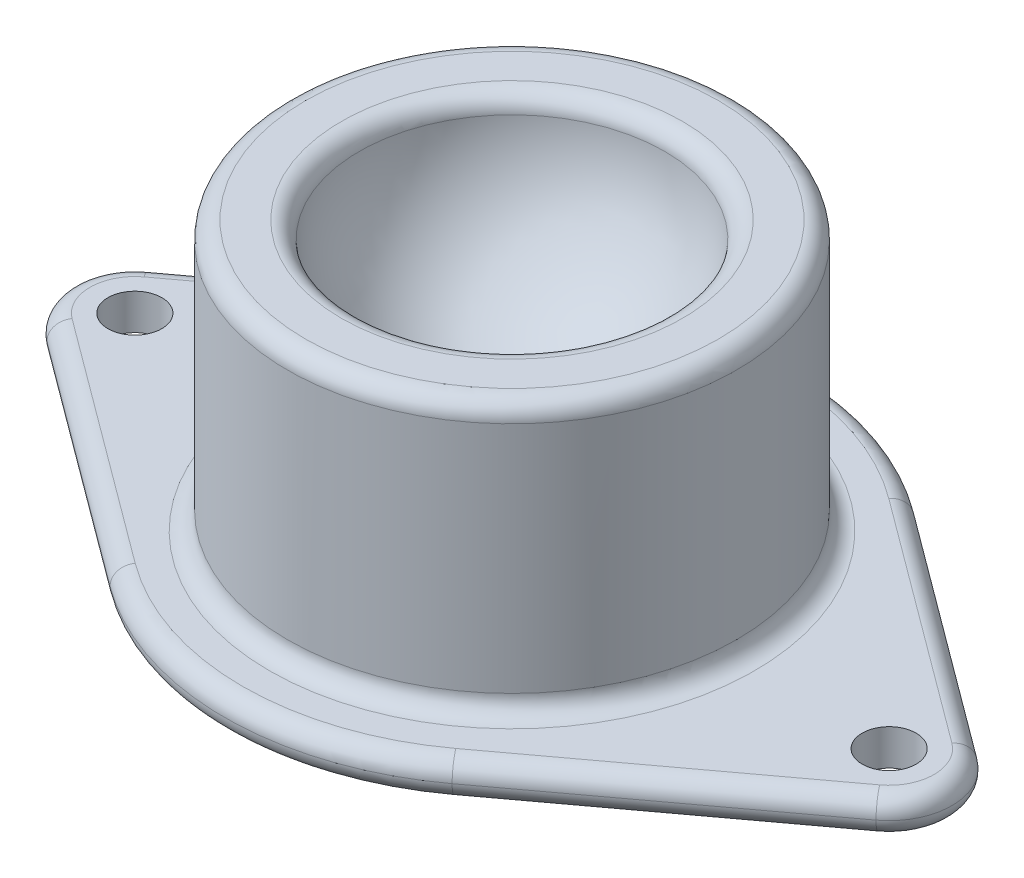
ISO-10303-21;
HEADER;
FILE_DESCRIPTION(('STEP AP214'),'2;1');
FILE_NAME('part.step','',(''),(''),'','','');
FILE_SCHEMA(('AUTOMOTIVE_DESIGN { 1 0 10303 214 1 1 1 1 }'));
ENDSEC;
DATA;
#1=APPLICATION_CONTEXT('core data for automotive mechanical design processes');
#2=APPLICATION_PROTOCOL_DEFINITION('international standard','automotive_design',2000,#1);
#3=PRODUCT_CONTEXT('',#1,'mechanical');
#4=PRODUCT('Part','Part','',(#3));
#5=PRODUCT_RELATED_PRODUCT_CATEGORY('part','',(#4));
#6=PRODUCT_DEFINITION_FORMATION('','',#4);
#7=PRODUCT_DEFINITION_CONTEXT('part definition',#1,'design');
#8=PRODUCT_DEFINITION('design','',#6,#7);
#9=PRODUCT_DEFINITION_SHAPE('','',#8);
#10=(LENGTH_UNIT() NAMED_UNIT(*) SI_UNIT(.MILLI.,.METRE.));
#11=(NAMED_UNIT(*) PLANE_ANGLE_UNIT() SI_UNIT($,.RADIAN.));
#12=(NAMED_UNIT(*) SI_UNIT($,.STERADIAN.) SOLID_ANGLE_UNIT());
#13=UNCERTAINTY_MEASURE_WITH_UNIT(LENGTH_MEASURE(1.E-05),#10,'distance_accuracy_value','');
#14=(GEOMETRIC_REPRESENTATION_CONTEXT(3) GLOBAL_UNCERTAINTY_ASSIGNED_CONTEXT((#13)) GLOBAL_UNIT_ASSIGNED_CONTEXT((#10,
#11,#12)) REPRESENTATION_CONTEXT('',''));
#15=CARTESIAN_POINT('',(0.,0.,0.));
#16=DIRECTION('',(0.,0.,1.));
#17=DIRECTION('',(1.,0.,0.));
#18=AXIS2_PLACEMENT_3D('',#15,#16,#17);
#19=CARTESIAN_POINT('',(-21.,2.,0.));
#20=DIRECTION('',(0.,-1.,0.));
#21=DIRECTION('',(0.,0.,-1.));
#22=AXIS2_PLACEMENT_3D('',#19,#20,#21);
#23=CYLINDRICAL_SURFACE('',#22,1.5);
#24=CARTESIAN_POINT('',(-21.,2.,0.));
#25=DIRECTION('',(0.,1.,0.));
#26=DIRECTION('',(0.,0.,1.));
#27=AXIS2_PLACEMENT_3D('',#24,#25,#26);
#28=CIRCLE('',#27,1.5);
#29=CARTESIAN_POINT('',(-21.,2.,1.5));
#30=VERTEX_POINT('',#29);
#31=EDGE_CURVE('E304',#30,#30,#28,.T.);
#32=ORIENTED_EDGE('',*,*,#31,.T.);
#33=EDGE_LOOP('',(#32));
#34=FACE_BOUND('',#33,.T.);
#35=CARTESIAN_POINT('',(-21.,0.,0.));
#36=DIRECTION('',(0.,1.,0.));
#37=DIRECTION('',(0.,0.,1.));
#38=AXIS2_PLACEMENT_3D('',#35,#36,#37);
#39=CIRCLE('',#38,1.5);
#40=CARTESIAN_POINT('',(-21.,0.,1.5));
#41=VERTEX_POINT('',#40);
#42=EDGE_CURVE('E150',#41,#41,#39,.T.);
#43=ORIENTED_EDGE('',*,*,#42,.F.);
#44=EDGE_LOOP('',(#43));
#45=FACE_BOUND('',#44,.T.);
#46=ADVANCED_FACE('F41',(#34,#45),#23,.F.);
#47=CARTESIAN_POINT('',(21.,2.,0.));
#48=DIRECTION('',(0.,-1.,0.));
#49=DIRECTION('',(0.,0.,-1.));
#50=AXIS2_PLACEMENT_3D('',#47,#48,#49);
#51=CYLINDRICAL_SURFACE('',#50,1.5);
#52=CARTESIAN_POINT('',(21.,2.,0.));
#53=DIRECTION('',(0.,1.,0.));
#54=DIRECTION('',(0.,0.,1.));
#55=AXIS2_PLACEMENT_3D('',#52,#53,#54);
#56=CIRCLE('',#55,1.5);
#57=CARTESIAN_POINT('',(21.,2.,1.5));
#58=VERTEX_POINT('',#57);
#59=EDGE_CURVE('E300',#58,#58,#56,.T.);
#60=ORIENTED_EDGE('',*,*,#59,.T.);
#61=EDGE_LOOP('',(#60));
#62=FACE_BOUND('',#61,.T.);
#63=CARTESIAN_POINT('',(21.,0.,0.));
#64=DIRECTION('',(0.,1.,0.));
#65=DIRECTION('',(0.,0.,1.));
#66=AXIS2_PLACEMENT_3D('',#63,#64,#65);
#67=CIRCLE('',#66,1.5);
#68=CARTESIAN_POINT('',(21.,0.,1.5));
#69=VERTEX_POINT('',#68);
#70=EDGE_CURVE('E301',#69,#69,#67,.T.);
#71=ORIENTED_EDGE('',*,*,#70,.F.);
#72=EDGE_LOOP('',(#71));
#73=FACE_BOUND('',#72,.T.);
#74=ADVANCED_FACE('F317',(#62,#73),#51,.F.);
#75=CARTESIAN_POINT('',(0.,2.,0.));
#76=DIRECTION('',(0.,1.,0.));
#77=DIRECTION('',(0.,0.,1.));
#78=AXIS2_PLACEMENT_3D('',#75,#76,#77);
#79=PLANE('',#78);
#80=DIRECTION('',(-0.803549382413629,0.,0.595238095238095));
#81=VECTOR('',#80,1.);
#82=CARTESIAN_POINT('',(8.92857142857142,2.,12.0532407362044));
#83=LINE('',#82,#81);
#84=CARTESIAN_POINT('',(8.92857142857143,2.,12.0532407362044));
#85=VERTEX_POINT('',#84);
#86=CARTESIAN_POINT('',(22.4880952380952,2.,2.00887345603407));
#87=VERTEX_POINT('',#86);
#88=EDGE_CURVE('E60',#85,#87,#83,.F.);
#89=ORIENTED_EDGE('',*,*,#88,.T.);
#90=CARTESIAN_POINT('',(21.,2.,0.));
#91=DIRECTION('',(0.,1.,0.));
#92=DIRECTION('',(0.,0.,1.));
#93=AXIS2_PLACEMENT_3D('',#90,#91,#92);
#94=CIRCLE('',#93,2.5);
#95=CARTESIAN_POINT('',(22.4880952380952,2.,-2.00887345603407));
#96=VERTEX_POINT('',#95);
#97=EDGE_CURVE('E155',#87,#96,#94,.T.);
#98=ORIENTED_EDGE('',*,*,#97,.T.);
#99=DIRECTION('',(-0.803549382413629,0.,-0.595238095238095));
#100=VECTOR('',#99,1.);
#101=CARTESIAN_POINT('',(8.92857142857142,2.,-12.0532407362044));
#102=LINE('',#101,#100);
#103=CARTESIAN_POINT('',(8.92857142857142,2.,-12.0532407362044));
#104=VERTEX_POINT('',#103);
#105=EDGE_CURVE('E256',#96,#104,#102,.T.);
#106=ORIENTED_EDGE('',*,*,#105,.T.);
#107=CARTESIAN_POINT('',(0.,2.,0.));
#108=DIRECTION('',(0.,1.,0.));
#109=DIRECTION('',(0.,0.,1.));
#110=AXIS2_PLACEMENT_3D('',#107,#108,#109);
#111=CIRCLE('',#110,15.);
#112=CARTESIAN_POINT('',(-8.92857142857143,2.,-12.0532407362044));
#113=VERTEX_POINT('',#112);
#114=EDGE_CURVE('E258',#104,#113,#111,.T.);
#115=ORIENTED_EDGE('',*,*,#114,.T.);
#116=DIRECTION('',(-0.803549382413629,0.,0.595238095238095));
#117=VECTOR('',#116,1.);
#118=CARTESIAN_POINT('',(-22.4880952380952,2.,-2.00887345603406));
#119=LINE('',#118,#117);
#120=CARTESIAN_POINT('',(-22.4880952380952,2.,-2.00887345603407));
#121=VERTEX_POINT('',#120);
#122=EDGE_CURVE('E266',#113,#121,#119,.T.);
#123=ORIENTED_EDGE('',*,*,#122,.T.);
#124=CARTESIAN_POINT('',(-21.,2.,0.));
#125=DIRECTION('',(0.,1.,0.));
#126=DIRECTION('',(0.,0.,1.));
#127=AXIS2_PLACEMENT_3D('',#124,#125,#126);
#128=CIRCLE('',#127,2.5);
#129=CARTESIAN_POINT('',(-22.4880952380952,2.,2.00887345603407));
#130=VERTEX_POINT('',#129);
#131=EDGE_CURVE('E145',#121,#130,#128,.T.);
#132=ORIENTED_EDGE('',*,*,#131,.T.);
#133=DIRECTION('',(0.803549382413629,0.,0.595238095238095));
#134=VECTOR('',#133,1.);
#135=CARTESIAN_POINT('',(-8.92857142857143,2.,12.0532407362044));
#136=LINE('',#135,#134);
#137=CARTESIAN_POINT('',(-8.92857142857143,2.,12.0532407362044));
#138=VERTEX_POINT('',#137);
#139=EDGE_CURVE('E139',#130,#138,#136,.T.);
#140=ORIENTED_EDGE('',*,*,#139,.T.);
#141=CARTESIAN_POINT('',(0.,2.,0.));
#142=DIRECTION('',(0.,1.,0.));
#143=DIRECTION('',(0.,0.,1.));
#144=AXIS2_PLACEMENT_3D('',#141,#142,#143);
#145=CIRCLE('',#144,15.);
#146=EDGE_CURVE('E142',#138,#85,#145,.T.);
#147=ORIENTED_EDGE('',*,*,#146,.T.);
#148=EDGE_LOOP('',(#89,#98,#106,#115,#123,#132,#140,#147));
#149=FACE_BOUND('',#148,.T.);
#150=CARTESIAN_POINT('',(0.,2.,0.));
#151=DIRECTION('',(0.,1.,0.));
#152=DIRECTION('',(0.,0.,1.));
#153=AXIS2_PLACEMENT_3D('',#150,#151,#152);
#154=CIRCLE('',#153,13.5);
#155=CARTESIAN_POINT('',(0.,2.,13.5));
#156=VERTEX_POINT('',#155);
#157=EDGE_CURVE('E261',#156,#156,#154,.F.);
#158=ORIENTED_EDGE('',*,*,#157,.T.);
#159=EDGE_LOOP('',(#158));
#160=FACE_BOUND('',#159,.T.);
#161=ORIENTED_EDGE('',*,*,#31,.F.);
#162=EDGE_LOOP('',(#161));
#163=FACE_BOUND('',#162,.T.);
#164=ORIENTED_EDGE('',*,*,#59,.F.);
#165=EDGE_LOOP('',(#164));
#166=FACE_BOUND('',#165,.T.);
#167=ADVANCED_FACE('F140',(#149,#160,#163,#166),#79,.T.);
#168=CARTESIAN_POINT('',(0.,0.,0.));
#169=DIRECTION('',(0.,1.,0.));
#170=DIRECTION('',(0.,0.,1.));
#171=AXIS2_PLACEMENT_3D('',#168,#169,#170);
#172=PLANE('',#171);
#173=CARTESIAN_POINT('',(0.,0.,0.));
#174=DIRECTION('',(0.,1.,0.));
#175=DIRECTION('',(0.,0.,1.));
#176=AXIS2_PLACEMENT_3D('',#173,#174,#175);
#177=CIRCLE('',#176,15.);
#178=CARTESIAN_POINT('',(-8.92857142857143,0.,-12.0532407362044));
#179=VERTEX_POINT('',#178);
#180=CARTESIAN_POINT('',(8.92857142857143,0.,-12.0532407362044));
#181=VERTEX_POINT('',#180);
#182=EDGE_CURVE('E280',#179,#181,#177,.F.);
#183=ORIENTED_EDGE('',*,*,#182,.T.);
#184=DIRECTION('',(-0.803549382413629,0.,-0.595238095238095));
#185=VECTOR('',#184,1.);
#186=CARTESIAN_POINT('',(8.92857142857142,0.,-12.0532407362044));
#187=LINE('',#186,#185);
#188=CARTESIAN_POINT('',(22.4880952380952,0.,-2.00887345603407));
#189=VERTEX_POINT('',#188);
#190=EDGE_CURVE('E276',#181,#189,#187,.F.);
#191=ORIENTED_EDGE('',*,*,#190,.T.);
#192=CARTESIAN_POINT('',(21.,0.,0.));
#193=DIRECTION('',(0.,1.,0.));
#194=DIRECTION('',(0.,0.,1.));
#195=AXIS2_PLACEMENT_3D('',#192,#193,#194);
#196=CIRCLE('',#195,2.5);
#197=CARTESIAN_POINT('',(22.4880952380952,0.,2.00887345603407));
#198=VERTEX_POINT('',#197);
#199=EDGE_CURVE('E290',#189,#198,#196,.F.);
#200=ORIENTED_EDGE('',*,*,#199,.T.);
#201=DIRECTION('',(-0.803549382413629,0.,0.595238095238095));
#202=VECTOR('',#201,1.);
#203=CARTESIAN_POINT('',(8.92857142857143,0.,12.0532407362044));
#204=LINE('',#203,#202);
#205=CARTESIAN_POINT('',(8.92857142857143,0.,12.0532407362044));
#206=VERTEX_POINT('',#205);
#207=EDGE_CURVE('E292',#198,#206,#204,.T.);
#208=ORIENTED_EDGE('',*,*,#207,.T.);
#209=CARTESIAN_POINT('',(0.,0.,0.));
#210=DIRECTION('',(0.,1.,0.));
#211=DIRECTION('',(0.,0.,1.));
#212=AXIS2_PLACEMENT_3D('',#209,#210,#211);
#213=CIRCLE('',#212,15.);
#214=CARTESIAN_POINT('',(-8.92857142857143,0.,12.0532407362044));
#215=VERTEX_POINT('',#214);
#216=EDGE_CURVE('E294',#206,#215,#213,.F.);
#217=ORIENTED_EDGE('',*,*,#216,.T.);
#218=DIRECTION('',(0.803549382413629,0.,0.595238095238095));
#219=VECTOR('',#218,1.);
#220=CARTESIAN_POINT('',(-8.92857142857143,0.,12.0532407362044));
#221=LINE('',#220,#219);
#222=CARTESIAN_POINT('',(-22.4880952380952,0.,2.00887345603407));
#223=VERTEX_POINT('',#222);
#224=EDGE_CURVE('E244',#215,#223,#221,.F.);
#225=ORIENTED_EDGE('',*,*,#224,.T.);
#226=CARTESIAN_POINT('',(-21.,0.,0.));
#227=DIRECTION('',(0.,1.,0.));
#228=DIRECTION('',(0.,0.,1.));
#229=AXIS2_PLACEMENT_3D('',#226,#227,#228);
#230=CIRCLE('',#229,2.5);
#231=CARTESIAN_POINT('',(-22.4880952380952,0.,-2.00887345603407));
#232=VERTEX_POINT('',#231);
#233=EDGE_CURVE('E240',#223,#232,#230,.F.);
#234=ORIENTED_EDGE('',*,*,#233,.T.);
#235=DIRECTION('',(-0.803549382413629,0.,0.595238095238095));
#236=VECTOR('',#235,1.);
#237=CARTESIAN_POINT('',(-8.92857142857142,0.,-12.0532407362044));
#238=LINE('',#237,#236);
#239=EDGE_CURVE('E103',#232,#179,#238,.F.);
#240=ORIENTED_EDGE('',*,*,#239,.T.);
#241=EDGE_LOOP('',(#183,#191,#200,#208,#217,#225,#234,#240));
#242=FACE_BOUND('',#241,.T.);
#243=ORIENTED_EDGE('',*,*,#42,.T.);
#244=EDGE_LOOP('',(#243));
#245=FACE_BOUND('',#244,.T.);
#246=ORIENTED_EDGE('',*,*,#70,.T.);
#247=EDGE_LOOP('',(#246));
#248=FACE_BOUND('',#247,.T.);
#249=ADVANCED_FACE('F316',(#242,#245,#248),#172,.F.);
#250=CARTESIAN_POINT('',(0.,2.,0.));
#251=DIRECTION('',(0.,-1.,0.));
#252=DIRECTION('',(0.,0.,-1.));
#253=AXIS2_PLACEMENT_3D('',#250,#251,#252);
#254=CYLINDRICAL_SURFACE('',#253,12.5);
#255=CARTESIAN_POINT('',(0.,3.,0.));
#256=DIRECTION('',(0.,1.,0.));
#257=DIRECTION('',(0.,0.,1.));
#258=AXIS2_PLACEMENT_3D('',#255,#256,#257);
#259=CIRCLE('',#258,12.5);
#260=CARTESIAN_POINT('',(0.,3.,12.5));
#261=VERTEX_POINT('',#260);
#262=EDGE_CURVE('E163',#261,#261,#259,.T.);
#263=ORIENTED_EDGE('',*,*,#262,.T.);
#264=EDGE_LOOP('',(#263));
#265=FACE_BOUND('',#264,.T.);
#266=CARTESIAN_POINT('',(0.,16.,0.));
#267=DIRECTION('',(0.,-1.,0.));
#268=DIRECTION('',(0.,0.,-1.));
#269=AXIS2_PLACEMENT_3D('',#266,#267,#268);
#270=CIRCLE('',#269,12.5);
#271=CARTESIAN_POINT('',(0.,16.,-12.5));
#272=VERTEX_POINT('',#271);
#273=EDGE_CURVE('E160',#272,#272,#270,.T.);
#274=ORIENTED_EDGE('',*,*,#273,.T.);
#275=EDGE_LOOP('',(#274));
#276=FACE_BOUND('',#275,.T.);
#277=ADVANCED_FACE('F327',(#265,#276),#254,.T.);
#278=CARTESIAN_POINT('',(0.,17.,8.5));
#279=DIRECTION('',(0.,-1.,0.));
#280=DIRECTION('',(0.,0.,-1.));
#281=AXIS2_PLACEMENT_3D('',#278,#279,#280);
#282=PLANE('',#281);
#283=CARTESIAN_POINT('',(0.,17.,0.));
#284=DIRECTION('',(0.,-1.,0.));
#285=DIRECTION('',(0.,0.,-1.));
#286=AXIS2_PLACEMENT_3D('',#283,#284,#285);
#287=CIRCLE('',#286,11.5);
#288=CARTESIAN_POINT('',(0.,17.,-11.5));
#289=VERTEX_POINT('',#288);
#290=EDGE_CURVE('E51',#289,#289,#287,.F.);
#291=ORIENTED_EDGE('',*,*,#290,.T.);
#292=EDGE_LOOP('',(#291));
#293=FACE_BOUND('',#292,.T.);
#294=CARTESIAN_POINT('',(0.,17.,0.));
#295=DIRECTION('',(0.,-1.,0.));
#296=DIRECTION('',(0.,0.,-1.));
#297=AXIS2_PLACEMENT_3D('',#294,#295,#296);
#298=CIRCLE('',#297,9.5);
#299=CARTESIAN_POINT('',(0.,17.,-9.5));
#300=VERTEX_POINT('',#299);
#301=EDGE_CURVE('E166',#300,#300,#298,.T.);
#302=ORIENTED_EDGE('',*,*,#301,.T.);
#303=EDGE_LOOP('',(#302));
#304=FACE_BOUND('',#303,.T.);
#305=ADVANCED_FACE('F332',(#293,#304),#282,.F.);
#306=CARTESIAN_POINT('',(0.,16.5138888888889,0.));
#307=DIRECTION('',(0.,-1.,0.));
#308=DIRECTION('',(0.,0.,-1.));
#309=AXIS2_PLACEMENT_3D('',#306,#307,#308);
#310=SPHERICAL_SURFACE('',#309,8.51388888888889);
#311=CARTESIAN_POINT('',(0.,16.0540145985401,0.));
#312=DIRECTION('',(0.,1.,0.));
#313=DIRECTION('',(0.,0.,1.));
#314=AXIS2_PLACEMENT_3D('',#311,#312,#313);
#315=CIRCLE('',#314,8.5014598540146);
#316=CARTESIAN_POINT('',(0.,16.0540145985401,8.5014598540146));
#317=VERTEX_POINT('',#316);
#318=EDGE_CURVE('E12',#317,#317,#315,.T.);
#319=ORIENTED_EDGE('',*,*,#318,.T.);
#320=EDGE_LOOP('',(#319));
#321=FACE_BOUND('',#320,.T.);
#322=ADVANCED_FACE('F378',(#321),#310,.F.);
#323=CARTESIAN_POINT('',(-8.92857142857143,1.,12.0532407362044));
#324=DIRECTION('',(-0.803549382413629,0.,-0.595238095238095));
#325=DIRECTION('',(-0.595238095238095,0.,0.803549382413629));
#326=AXIS2_PLACEMENT_3D('',#323,#324,#325);
#327=CYLINDRICAL_SURFACE('',#326,1.);
#328=CARTESIAN_POINT('',(-8.92857142857143,1.,12.0532407362044));
#329=DIRECTION('',(0.803549382413629,0.,0.595238095238095));
#330=DIRECTION('',(0.595238095238095,0.,-0.803549382413629));
#331=AXIS2_PLACEMENT_3D('',#328,#329,#330);
#332=CIRCLE('',#331,1.);
#333=CARTESIAN_POINT('',(-9.52380952380953,1.,12.8567901186181));
#334=VERTEX_POINT('',#333);
#335=EDGE_CURVE('E45',#138,#334,#332,.T.);
#336=ORIENTED_EDGE('',*,*,#335,.F.);
#337=ORIENTED_EDGE('',*,*,#139,.F.);
#338=CARTESIAN_POINT('',(-22.4880952380952,1.,2.00887345603406));
#339=DIRECTION('',(-0.803549382413628,0.,-0.595238095238096));
#340=DIRECTION('',(-0.595238095238096,0.,0.803549382413628));
#341=AXIS2_PLACEMENT_3D('',#338,#339,#340);
#342=CIRCLE('',#341,1.);
#343=CARTESIAN_POINT('',(-23.0833333333333,1.,2.8124228384477));
#344=VERTEX_POINT('',#343);
#345=EDGE_CURVE('E89',#344,#130,#342,.T.);
#346=ORIENTED_EDGE('',*,*,#345,.F.);
#347=DIRECTION('',(0.803549382413629,0.,0.595238095238095));
#348=VECTOR('',#347,1.);
#349=CARTESIAN_POINT('',(-23.0833333333333,1.,2.81242283844769));
#350=LINE('',#349,#348);
#351=EDGE_CURVE('E148',#334,#344,#350,.F.);
#352=ORIENTED_EDGE('',*,*,#351,.F.);
#353=EDGE_LOOP('',(#336,#337,#346,#352));
#354=FACE_BOUND('',#353,.T.);
#355=ADVANCED_FACE('F147',(#354),#327,.T.);
#356=CARTESIAN_POINT('',(0.,1.,0.));
#357=DIRECTION('',(0.,1.,0.));
#358=DIRECTION('',(0.,0.,1.));
#359=AXIS2_PLACEMENT_3D('',#356,#357,#358);
#360=TOROIDAL_SURFACE('',#359,15.,1.);
#361=ORIENTED_EDGE('',*,*,#146,.F.);
#362=ORIENTED_EDGE('',*,*,#335,.T.);
#363=CARTESIAN_POINT('',(0.,1.,0.));
#364=DIRECTION('',(0.,1.,0.));
#365=DIRECTION('',(0.,0.,1.));
#366=AXIS2_PLACEMENT_3D('',#363,#364,#365);
#367=CIRCLE('',#366,16.);
#368=CARTESIAN_POINT('',(9.52380952380952,1.,12.8567901186181));
#369=VERTEX_POINT('',#368);
#370=EDGE_CURVE('E225',#369,#334,#367,.F.);
#371=ORIENTED_EDGE('',*,*,#370,.F.);
#372=CARTESIAN_POINT('',(8.92857142857143,1.,12.0532407362044));
#373=DIRECTION('',(0.803549382413629,0.,-0.595238095238095));
#374=DIRECTION('',(-0.595238095238095,0.,-0.803549382413629));
#375=AXIS2_PLACEMENT_3D('',#372,#373,#374);
#376=CIRCLE('',#375,1.);
#377=EDGE_CURVE('E153',#85,#369,#376,.T.);
#378=ORIENTED_EDGE('',*,*,#377,.F.);
#379=EDGE_LOOP('',(#361,#362,#371,#378));
#380=FACE_BOUND('',#379,.T.);
#381=ADVANCED_FACE('F151',(#380),#360,.T.);
#382=CARTESIAN_POINT('',(-21.,1.,0.));
#383=DIRECTION('',(0.,1.,0.));
#384=DIRECTION('',(0.,0.,1.));
#385=AXIS2_PLACEMENT_3D('',#382,#383,#384);
#386=TOROIDAL_SURFACE('',#385,2.5,1.);
#387=ORIENTED_EDGE('',*,*,#345,.T.);
#388=ORIENTED_EDGE('',*,*,#131,.F.);
#389=CARTESIAN_POINT('',(-22.4880952380952,1.,-2.00887345603407));
#390=DIRECTION('',(0.803549382413628,0.,-0.595238095238096));
#391=DIRECTION('',(-0.595238095238096,0.,-0.803549382413628));
#392=AXIS2_PLACEMENT_3D('',#389,#390,#391);
#393=CIRCLE('',#392,1.);
#394=CARTESIAN_POINT('',(-23.0833333333333,1.,-2.8124228384477));
#395=VERTEX_POINT('',#394);
#396=EDGE_CURVE('E221',#395,#121,#393,.T.);
#397=ORIENTED_EDGE('',*,*,#396,.F.);
#398=CARTESIAN_POINT('',(-21.,1.,0.));
#399=DIRECTION('',(0.,1.,0.));
#400=DIRECTION('',(0.,0.,1.));
#401=AXIS2_PLACEMENT_3D('',#398,#399,#400);
#402=CIRCLE('',#401,3.5);
#403=EDGE_CURVE('E218',#344,#395,#402,.F.);
#404=ORIENTED_EDGE('',*,*,#403,.F.);
#405=EDGE_LOOP('',(#387,#388,#397,#404));
#406=FACE_BOUND('',#405,.T.);
#407=ADVANCED_FACE('F233',(#406),#386,.T.);
#408=CARTESIAN_POINT('',(-8.92857142857143,1.,12.0532407362044));
#409=DIRECTION('',(0.803549382413629,0.,0.595238095238095));
#410=DIRECTION('',(0.595238095238095,0.,-0.803549382413629));
#411=AXIS2_PLACEMENT_3D('',#408,#409,#410);
#412=CYLINDRICAL_SURFACE('',#411,1.);
#413=CARTESIAN_POINT('',(-22.4880952380952,1.,2.00887345603406));
#414=DIRECTION('',(-0.803549382413628,0.,-0.595238095238096));
#415=DIRECTION('',(-0.595238095238096,0.,0.803549382413628));
#416=AXIS2_PLACEMENT_3D('',#413,#414,#415);
#417=CIRCLE('',#416,1.);
#418=EDGE_CURVE('E215',#223,#344,#417,.T.);
#419=ORIENTED_EDGE('',*,*,#418,.F.);
#420=ORIENTED_EDGE('',*,*,#224,.F.);
#421=CARTESIAN_POINT('',(-8.92857142857143,1.,12.0532407362044));
#422=DIRECTION('',(0.803549382413629,0.,0.595238095238095));
#423=DIRECTION('',(0.595238095238095,0.,-0.803549382413629));
#424=AXIS2_PLACEMENT_3D('',#421,#422,#423);
#425=CIRCLE('',#424,1.);
#426=EDGE_CURVE('E228',#334,#215,#425,.T.);
#427=ORIENTED_EDGE('',*,*,#426,.F.);
#428=ORIENTED_EDGE('',*,*,#351,.T.);
#429=EDGE_LOOP('',(#419,#420,#427,#428));
#430=FACE_BOUND('',#429,.T.);
#431=ADVANCED_FACE('F243',(#430),#412,.T.);
#432=CARTESIAN_POINT('',(0.,1.,0.));
#433=DIRECTION('',(0.,1.,0.));
#434=DIRECTION('',(0.,0.,1.));
#435=AXIS2_PLACEMENT_3D('',#432,#433,#434);
#436=TOROIDAL_SURFACE('',#435,15.,1.);
#437=ORIENTED_EDGE('',*,*,#426,.T.);
#438=ORIENTED_EDGE('',*,*,#216,.F.);
#439=CARTESIAN_POINT('',(8.92857142857143,1.,12.0532407362044));
#440=DIRECTION('',(0.803549382413629,0.,-0.595238095238095));
#441=DIRECTION('',(-0.595238095238095,0.,-0.803549382413629));
#442=AXIS2_PLACEMENT_3D('',#439,#440,#441);
#443=CIRCLE('',#442,1.);
#444=EDGE_CURVE('E212',#369,#206,#443,.T.);
#445=ORIENTED_EDGE('',*,*,#444,.F.);
#446=ORIENTED_EDGE('',*,*,#370,.T.);
#447=EDGE_LOOP('',(#437,#438,#445,#446));
#448=FACE_BOUND('',#447,.T.);
#449=ADVANCED_FACE('F248',(#448),#436,.T.);
#450=CARTESIAN_POINT('',(8.92857142857142,1.,12.0532407362044));
#451=DIRECTION('',(-0.803549382413629,0.,0.595238095238095));
#452=DIRECTION('',(0.595238095238095,0.,0.803549382413629));
#453=AXIS2_PLACEMENT_3D('',#450,#451,#452);
#454=CYLINDRICAL_SURFACE('',#453,1.);
#455=ORIENTED_EDGE('',*,*,#88,.F.);
#456=ORIENTED_EDGE('',*,*,#377,.T.);
#457=DIRECTION('',(-0.803549382413629,0.,0.595238095238095));
#458=VECTOR('',#457,1.);
#459=CARTESIAN_POINT('',(9.52380952380952,1.,12.8567901186181));
#460=LINE('',#459,#458);
#461=CARTESIAN_POINT('',(23.0833333333333,1.,2.8124228384477));
#462=VERTEX_POINT('',#461);
#463=EDGE_CURVE('E209',#462,#369,#460,.T.);
#464=ORIENTED_EDGE('',*,*,#463,.F.);
#465=CARTESIAN_POINT('',(22.4880952380952,1.,2.00887345603407));
#466=DIRECTION('',(0.803549382413629,0.,-0.595238095238096));
#467=DIRECTION('',(-0.595238095238096,0.,-0.803549382413629));
#468=AXIS2_PLACEMENT_3D('',#465,#466,#467);
#469=CIRCLE('',#468,1.);
#470=EDGE_CURVE('E206',#87,#462,#469,.T.);
#471=ORIENTED_EDGE('',*,*,#470,.F.);
#472=EDGE_LOOP('',(#455,#456,#464,#471));
#473=FACE_BOUND('',#472,.T.);
#474=ADVANCED_FACE('F250',(#473),#454,.T.);
#475=CARTESIAN_POINT('',(-8.92857142857142,1.,-12.0532407362044));
#476=DIRECTION('',(0.803549382413629,0.,-0.595238095238095));
#477=DIRECTION('',(-0.595238095238095,0.,-0.803549382413629));
#478=AXIS2_PLACEMENT_3D('',#475,#476,#477);
#479=CYLINDRICAL_SURFACE('',#478,1.);
#480=ORIENTED_EDGE('',*,*,#396,.T.);
#481=ORIENTED_EDGE('',*,*,#122,.F.);
#482=CARTESIAN_POINT('',(-8.92857142857143,1.,-12.0532407362044));
#483=DIRECTION('',(0.803549382413629,0.,-0.595238095238095));
#484=DIRECTION('',(-0.595238095238095,0.,-0.803549382413629));
#485=AXIS2_PLACEMENT_3D('',#482,#483,#484);
#486=CIRCLE('',#485,1.);
#487=CARTESIAN_POINT('',(-9.52380952380952,1.,-12.8567901186181));
#488=VERTEX_POINT('',#487);
#489=EDGE_CURVE('E203',#488,#113,#486,.T.);
#490=ORIENTED_EDGE('',*,*,#489,.F.);
#491=DIRECTION('',(-0.803549382413629,0.,0.595238095238095));
#492=VECTOR('',#491,1.);
#493=CARTESIAN_POINT('',(-9.52380952380952,1.,-12.8567901186181));
#494=LINE('',#493,#492);
#495=EDGE_CURVE('E200',#395,#488,#494,.F.);
#496=ORIENTED_EDGE('',*,*,#495,.F.);
#497=EDGE_LOOP('',(#480,#481,#490,#496));
#498=FACE_BOUND('',#497,.T.);
#499=ADVANCED_FACE('F284',(#498),#479,.T.);
#500=CARTESIAN_POINT('',(-21.,1.,0.));
#501=DIRECTION('',(0.,1.,0.));
#502=DIRECTION('',(0.,0.,1.));
#503=AXIS2_PLACEMENT_3D('',#500,#501,#502);
#504=TOROIDAL_SURFACE('',#503,2.5,1.);
#505=ORIENTED_EDGE('',*,*,#418,.T.);
#506=ORIENTED_EDGE('',*,*,#403,.T.);
#507=CARTESIAN_POINT('',(-22.4880952380952,1.,-2.00887345603407));
#508=DIRECTION('',(0.803549382413628,0.,-0.595238095238096));
#509=DIRECTION('',(-0.595238095238097,0.,-0.803549382413628));
#510=AXIS2_PLACEMENT_3D('',#507,#508,#509);
#511=CIRCLE('',#510,1.);
#512=EDGE_CURVE('E197',#232,#395,#511,.T.);
#513=ORIENTED_EDGE('',*,*,#512,.F.);
#514=ORIENTED_EDGE('',*,*,#233,.F.);
#515=EDGE_LOOP('',(#505,#506,#513,#514));
#516=FACE_BOUND('',#515,.T.);
#517=ADVANCED_FACE('F239',(#516),#504,.T.);
#518=CARTESIAN_POINT('',(8.92857142857142,1.,12.0532407362044));
#519=DIRECTION('',(0.803549382413629,0.,-0.595238095238095));
#520=DIRECTION('',(-0.595238095238095,0.,-0.803549382413629));
#521=AXIS2_PLACEMENT_3D('',#518,#519,#520);
#522=CYLINDRICAL_SURFACE('',#521,1.);
#523=ORIENTED_EDGE('',*,*,#444,.T.);
#524=ORIENTED_EDGE('',*,*,#207,.F.);
#525=CARTESIAN_POINT('',(22.4880952380952,1.,2.00887345603407));
#526=DIRECTION('',(0.803549382413628,0.,-0.595238095238096));
#527=DIRECTION('',(-0.595238095238096,0.,-0.803549382413628));
#528=AXIS2_PLACEMENT_3D('',#525,#526,#527);
#529=CIRCLE('',#528,1.);
#530=EDGE_CURVE('E194',#462,#198,#529,.T.);
#531=ORIENTED_EDGE('',*,*,#530,.F.);
#532=ORIENTED_EDGE('',*,*,#463,.T.);
#533=EDGE_LOOP('',(#523,#524,#531,#532));
#534=FACE_BOUND('',#533,.T.);
#535=ADVANCED_FACE('F358',(#534),#522,.T.);
#536=CARTESIAN_POINT('',(21.,1.,0.));
#537=DIRECTION('',(0.,1.,0.));
#538=DIRECTION('',(0.,0.,1.));
#539=AXIS2_PLACEMENT_3D('',#536,#537,#538);
#540=TOROIDAL_SURFACE('',#539,2.5,1.);
#541=ORIENTED_EDGE('',*,*,#97,.F.);
#542=ORIENTED_EDGE('',*,*,#470,.T.);
#543=CARTESIAN_POINT('',(21.,1.,0.));
#544=DIRECTION('',(0.,1.,0.));
#545=DIRECTION('',(0.,0.,1.));
#546=AXIS2_PLACEMENT_3D('',#543,#544,#545);
#547=CIRCLE('',#546,3.5);
#548=CARTESIAN_POINT('',(23.0833333333333,1.,-2.8124228384477));
#549=VERTEX_POINT('',#548);
#550=EDGE_CURVE('E191',#549,#462,#547,.F.);
#551=ORIENTED_EDGE('',*,*,#550,.F.);
#552=CARTESIAN_POINT('',(22.4880952380952,1.,-2.00887345603407));
#553=DIRECTION('',(-0.803549382413628,0.,-0.595238095238096));
#554=DIRECTION('',(-0.595238095238097,0.,0.803549382413628));
#555=AXIS2_PLACEMENT_3D('',#552,#553,#554);
#556=CIRCLE('',#555,1.);
#557=EDGE_CURVE('E188',#96,#549,#556,.T.);
#558=ORIENTED_EDGE('',*,*,#557,.F.);
#559=EDGE_LOOP('',(#541,#542,#551,#558));
#560=FACE_BOUND('',#559,.T.);
#561=ADVANCED_FACE('F255',(#560),#540,.T.);
#562=CARTESIAN_POINT('',(0.,1.,0.));
#563=DIRECTION('',(0.,1.,0.));
#564=DIRECTION('',(0.,0.,1.));
#565=AXIS2_PLACEMENT_3D('',#562,#563,#564);
#566=TOROIDAL_SURFACE('',#565,15.,1.);
#567=ORIENTED_EDGE('',*,*,#489,.T.);
#568=ORIENTED_EDGE('',*,*,#114,.F.);
#569=CARTESIAN_POINT('',(8.92857142857143,1.,-12.0532407362044));
#570=DIRECTION('',(0.803549382413629,0.,0.595238095238095));
#571=DIRECTION('',(0.595238095238095,0.,-0.803549382413629));
#572=AXIS2_PLACEMENT_3D('',#569,#570,#571);
#573=CIRCLE('',#572,1.);
#574=CARTESIAN_POINT('',(9.52380952380952,1.,-12.8567901186181));
#575=VERTEX_POINT('',#574);
#576=EDGE_CURVE('E185',#575,#104,#573,.T.);
#577=ORIENTED_EDGE('',*,*,#576,.F.);
#578=CARTESIAN_POINT('',(0.,1.,0.));
#579=DIRECTION('',(0.,1.,0.));
#580=DIRECTION('',(0.,0.,1.));
#581=AXIS2_PLACEMENT_3D('',#578,#579,#580);
#582=CIRCLE('',#581,16.);
#583=EDGE_CURVE('E182',#488,#575,#582,.F.);
#584=ORIENTED_EDGE('',*,*,#583,.F.);
#585=EDGE_LOOP('',(#567,#568,#577,#584));
#586=FACE_BOUND('',#585,.T.);
#587=ADVANCED_FACE('F264',(#586),#566,.T.);
#588=CARTESIAN_POINT('',(-8.92857142857142,1.,-12.0532407362044));
#589=DIRECTION('',(-0.803549382413629,0.,0.595238095238095));
#590=DIRECTION('',(0.595238095238095,0.,0.803549382413629));
#591=AXIS2_PLACEMENT_3D('',#588,#589,#590);
#592=CYLINDRICAL_SURFACE('',#591,1.);
#593=ORIENTED_EDGE('',*,*,#512,.T.);
#594=ORIENTED_EDGE('',*,*,#495,.T.);
#595=CARTESIAN_POINT('',(-8.92857142857143,1.,-12.0532407362044));
#596=DIRECTION('',(0.803549382413629,0.,-0.595238095238095));
#597=DIRECTION('',(-0.595238095238095,0.,-0.803549382413629));
#598=AXIS2_PLACEMENT_3D('',#595,#596,#597);
#599=CIRCLE('',#598,1.);
#600=EDGE_CURVE('E179',#179,#488,#599,.T.);
#601=ORIENTED_EDGE('',*,*,#600,.F.);
#602=ORIENTED_EDGE('',*,*,#239,.F.);
#603=EDGE_LOOP('',(#593,#594,#601,#602));
#604=FACE_BOUND('',#603,.T.);
#605=ADVANCED_FACE('F282',(#604),#592,.T.);
#606=CARTESIAN_POINT('',(21.,1.,0.));
#607=DIRECTION('',(0.,1.,0.));
#608=DIRECTION('',(0.,0.,1.));
#609=AXIS2_PLACEMENT_3D('',#606,#607,#608);
#610=TOROIDAL_SURFACE('',#609,2.5,1.);
#611=ORIENTED_EDGE('',*,*,#530,.T.);
#612=ORIENTED_EDGE('',*,*,#199,.F.);
#613=CARTESIAN_POINT('',(22.4880952380952,1.,-2.00887345603407));
#614=DIRECTION('',(-0.803549382413628,0.,-0.595238095238096));
#615=DIRECTION('',(-0.595238095238096,0.,0.803549382413628));
#616=AXIS2_PLACEMENT_3D('',#613,#614,#615);
#617=CIRCLE('',#616,1.);
#618=EDGE_CURVE('E177',#549,#189,#617,.T.);
#619=ORIENTED_EDGE('',*,*,#618,.F.);
#620=ORIENTED_EDGE('',*,*,#550,.T.);
#621=EDGE_LOOP('',(#611,#612,#619,#620));
#622=FACE_BOUND('',#621,.T.);
#623=ADVANCED_FACE('F348',(#622),#610,.T.);
#624=CARTESIAN_POINT('',(8.92857142857142,1.,-12.0532407362044));
#625=DIRECTION('',(0.803549382413629,0.,0.595238095238095));
#626=DIRECTION('',(0.595238095238095,0.,-0.803549382413629));
#627=AXIS2_PLACEMENT_3D('',#624,#625,#626);
#628=CYLINDRICAL_SURFACE('',#627,1.);
#629=ORIENTED_EDGE('',*,*,#105,.F.);
#630=ORIENTED_EDGE('',*,*,#557,.T.);
#631=DIRECTION('',(-0.803549382413629,0.,-0.595238095238095));
#632=VECTOR('',#631,1.);
#633=CARTESIAN_POINT('',(23.0833333333333,1.,-2.8124228384477));
#634=LINE('',#633,#632);
#635=EDGE_CURVE('E174',#575,#549,#634,.F.);
#636=ORIENTED_EDGE('',*,*,#635,.F.);
#637=ORIENTED_EDGE('',*,*,#576,.T.);
#638=EDGE_LOOP('',(#629,#630,#636,#637));
#639=FACE_BOUND('',#638,.T.);
#640=ADVANCED_FACE('F269',(#639),#628,.T.);
#641=CARTESIAN_POINT('',(0.,1.,0.));
#642=DIRECTION('',(0.,1.,0.));
#643=DIRECTION('',(0.,0.,1.));
#644=AXIS2_PLACEMENT_3D('',#641,#642,#643);
#645=TOROIDAL_SURFACE('',#644,15.,1.);
#646=ORIENTED_EDGE('',*,*,#600,.T.);
#647=ORIENTED_EDGE('',*,*,#583,.T.);
#648=CARTESIAN_POINT('',(8.92857142857143,1.,-12.0532407362044));
#649=DIRECTION('',(0.803549382413629,0.,0.595238095238095));
#650=DIRECTION('',(0.595238095238095,0.,-0.803549382413629));
#651=AXIS2_PLACEMENT_3D('',#648,#649,#650);
#652=CIRCLE('',#651,1.);
#653=EDGE_CURVE('E171',#181,#575,#652,.T.);
#654=ORIENTED_EDGE('',*,*,#653,.F.);
#655=ORIENTED_EDGE('',*,*,#182,.F.);
#656=EDGE_LOOP('',(#646,#647,#654,#655));
#657=FACE_BOUND('',#656,.T.);
#658=ADVANCED_FACE('F279',(#657),#645,.T.);
#659=CARTESIAN_POINT('',(8.92857142857142,1.,-12.0532407362044));
#660=DIRECTION('',(-0.803549382413629,0.,-0.595238095238095));
#661=DIRECTION('',(-0.595238095238095,0.,0.803549382413629));
#662=AXIS2_PLACEMENT_3D('',#659,#660,#661);
#663=CYLINDRICAL_SURFACE('',#662,1.);
#664=ORIENTED_EDGE('',*,*,#618,.T.);
#665=ORIENTED_EDGE('',*,*,#190,.F.);
#666=ORIENTED_EDGE('',*,*,#653,.T.);
#667=ORIENTED_EDGE('',*,*,#635,.T.);
#668=EDGE_LOOP('',(#664,#665,#666,#667));
#669=FACE_BOUND('',#668,.T.);
#670=ADVANCED_FACE('F274',(#669),#663,.T.);
#671=CARTESIAN_POINT('',(0.,3.,0.));
#672=DIRECTION('',(0.,1.,0.));
#673=DIRECTION('',(0.,0.,1.));
#674=AXIS2_PLACEMENT_3D('',#671,#672,#673);
#675=TOROIDAL_SURFACE('',#674,13.5,1.);
#676=ORIENTED_EDGE('',*,*,#262,.F.);
#677=EDGE_LOOP('',(#676));
#678=FACE_BOUND('',#677,.T.);
#679=ORIENTED_EDGE('',*,*,#157,.F.);
#680=EDGE_LOOP('',(#679));
#681=FACE_BOUND('',#680,.T.);
#682=ADVANCED_FACE('F343',(#678,#681),#675,.F.);
#683=CARTESIAN_POINT('',(0.,16.,0.));
#684=DIRECTION('',(0.,-1.,0.));
#685=DIRECTION('',(0.,0.,-1.));
#686=AXIS2_PLACEMENT_3D('',#683,#684,#685);
#687=TOROIDAL_SURFACE('',#686,11.5,1.);
#688=ORIENTED_EDGE('',*,*,#290,.F.);
#689=EDGE_LOOP('',(#688));
#690=FACE_BOUND('',#689,.T.);
#691=ORIENTED_EDGE('',*,*,#273,.F.);
#692=EDGE_LOOP('',(#691));
#693=FACE_BOUND('',#692,.T.);
#694=ADVANCED_FACE('F380',(#690,#693),#687,.T.);
#695=CARTESIAN_POINT('',(0.,16.,0.));
#696=DIRECTION('',(0.,-1.,0.));
#697=DIRECTION('',(0.,0.,-1.));
#698=AXIS2_PLACEMENT_3D('',#695,#696,#697);
#699=TOROIDAL_SURFACE('',#698,9.5,1.);
#700=ORIENTED_EDGE('',*,*,#318,.F.);
#701=EDGE_LOOP('',(#700));
#702=FACE_BOUND('',#701,.T.);
#703=ORIENTED_EDGE('',*,*,#301,.F.);
#704=EDGE_LOOP('',(#703));
#705=FACE_BOUND('',#704,.T.);
#706=ADVANCED_FACE('F43',(#702,#705),#699,.T.);
#707=CLOSED_SHELL('',(#46,#74,#167,#249,#277,#305,#322,#355,#381,#407,#431,#449,#474,#499,#517,
#535,#561,#587,#605,#623,#640,#658,#670,#682,#694,#706));
#708=MANIFOLD_SOLID_BREP('B2',#707);
#709=ADVANCED_BREP_SHAPE_REPRESENTATION('',(#18,#708),#14);
#710=SHAPE_DEFINITION_REPRESENTATION(#9,#709);
ENDSEC;
END-ISO-10303-21;
